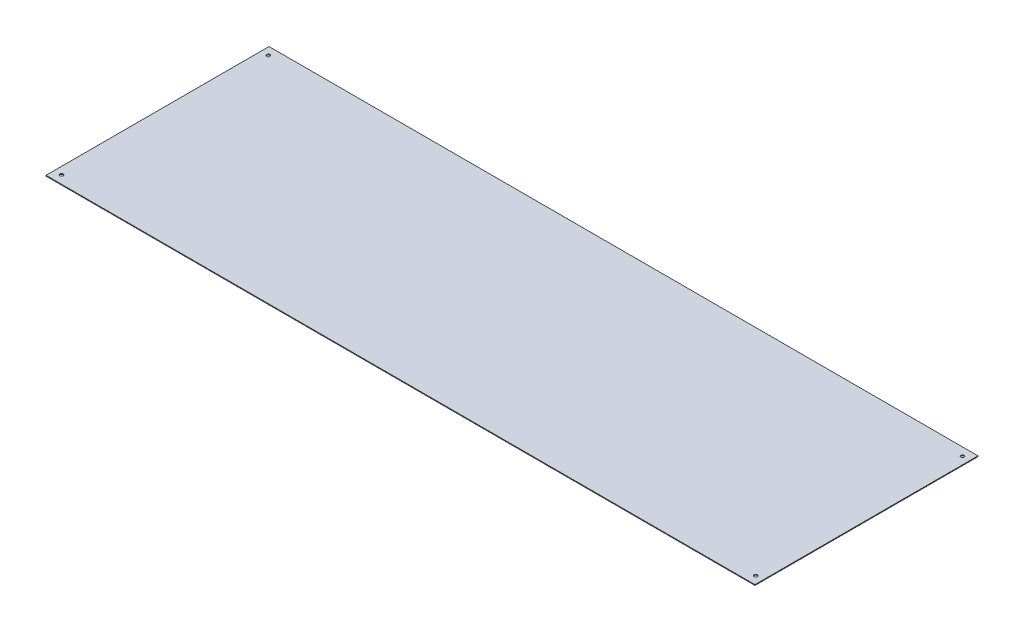
ISO-10303-21;
HEADER;
FILE_DESCRIPTION(('STEP AP214'),'2;1');
FILE_NAME('part.step','',(''),(''),'','','');
FILE_SCHEMA(('AUTOMOTIVE_DESIGN { 1 0 10303 214 1 1 1 1 }'));
ENDSEC;
DATA;
#1=APPLICATION_CONTEXT('core data for automotive mechanical design processes');
#2=APPLICATION_PROTOCOL_DEFINITION('international standard','automotive_design',2000,#1);
#3=PRODUCT_CONTEXT('',#1,'mechanical');
#4=PRODUCT('Part','Part','',(#3));
#5=PRODUCT_RELATED_PRODUCT_CATEGORY('part','',(#4));
#6=PRODUCT_DEFINITION_FORMATION('','',#4);
#7=PRODUCT_DEFINITION_CONTEXT('part definition',#1,'design');
#8=PRODUCT_DEFINITION('design','',#6,#7);
#9=PRODUCT_DEFINITION_SHAPE('','',#8);
#10=(LENGTH_UNIT() NAMED_UNIT(*) SI_UNIT(.MILLI.,.METRE.));
#11=(NAMED_UNIT(*) PLANE_ANGLE_UNIT() SI_UNIT($,.RADIAN.));
#12=(NAMED_UNIT(*) SI_UNIT($,.STERADIAN.) SOLID_ANGLE_UNIT());
#13=UNCERTAINTY_MEASURE_WITH_UNIT(LENGTH_MEASURE(1.E-05),#10,'distance_accuracy_value','');
#14=(GEOMETRIC_REPRESENTATION_CONTEXT(3) GLOBAL_UNCERTAINTY_ASSIGNED_CONTEXT((#13)) GLOBAL_UNIT_ASSIGNED_CONTEXT((#10,
#11,#12)) REPRESENTATION_CONTEXT('',''));
#15=CARTESIAN_POINT('',(0.,0.,0.));
#16=DIRECTION('',(0.,0.,1.));
#17=DIRECTION('',(1.,0.,0.));
#18=AXIS2_PLACEMENT_3D('',#15,#16,#17);
#19=CARTESIAN_POINT('',(960.,0.,302.));
#20=DIRECTION('',(1.,0.,0.));
#21=DIRECTION('',(0.,0.,-1.));
#22=AXIS2_PLACEMENT_3D('',#19,#20,#21);
#23=PLANE('',#22);
#24=DIRECTION('',(0.,1.,0.));
#25=VECTOR('',#24,1.);
#26=CARTESIAN_POINT('',(960.,0.,302.));
#27=LINE('',#26,#25);
#28=CARTESIAN_POINT('',(960.,0.,302.));
#29=VERTEX_POINT('',#28);
#30=CARTESIAN_POINT('',(960.,2.,302.));
#31=VERTEX_POINT('',#30);
#32=EDGE_CURVE('E11',#29,#31,#27,.T.);
#33=ORIENTED_EDGE('',*,*,#32,.F.);
#34=DIRECTION('',(0.,0.,-1.));
#35=VECTOR('',#34,1.);
#36=CARTESIAN_POINT('',(960.,0.,302.));
#37=LINE('',#36,#35);
#38=CARTESIAN_POINT('',(960.,0.,-302.));
#39=VERTEX_POINT('',#38);
#40=EDGE_CURVE('E108',#29,#39,#37,.T.);
#41=ORIENTED_EDGE('',*,*,#40,.T.);
#42=DIRECTION('',(0.,1.,0.));
#43=VECTOR('',#42,1.);
#44=CARTESIAN_POINT('',(960.,0.,-302.));
#45=LINE('',#44,#43);
#46=CARTESIAN_POINT('',(960.,2.,-302.));
#47=VERTEX_POINT('',#46);
#48=EDGE_CURVE('E58',#39,#47,#45,.T.);
#49=ORIENTED_EDGE('',*,*,#48,.T.);
#50=DIRECTION('',(0.,0.,1.));
#51=VECTOR('',#50,1.);
#52=CARTESIAN_POINT('',(960.,2.,0.));
#53=LINE('',#52,#51);
#54=EDGE_CURVE('E122',#31,#47,#53,.F.);
#55=ORIENTED_EDGE('',*,*,#54,.F.);
#56=EDGE_LOOP('',(#33,#41,#49,#55));
#57=FACE_BOUND('',#56,.T.);
#58=ADVANCED_FACE('F47',(#57),#23,.T.);
#59=CARTESIAN_POINT('',(960.,0.,-302.));
#60=DIRECTION('',(0.,0.,-1.));
#61=DIRECTION('',(-1.,0.,0.));
#62=AXIS2_PLACEMENT_3D('',#59,#60,#61);
#63=PLANE('',#62);
#64=ORIENTED_EDGE('',*,*,#48,.F.);
#65=DIRECTION('',(-1.,0.,0.));
#66=VECTOR('',#65,1.);
#67=CARTESIAN_POINT('',(960.,0.,-302.));
#68=LINE('',#67,#66);
#69=CARTESIAN_POINT('',(-960.000000000001,0.,-302.));
#70=VERTEX_POINT('',#69);
#71=EDGE_CURVE('E99',#39,#70,#68,.T.);
#72=ORIENTED_EDGE('',*,*,#71,.T.);
#73=DIRECTION('',(0.,1.,0.));
#74=VECTOR('',#73,1.);
#75=CARTESIAN_POINT('',(-960.000000000001,0.,-302.));
#76=LINE('',#75,#74);
#77=CARTESIAN_POINT('',(-960.000000000001,2.,-302.));
#78=VERTEX_POINT('',#77);
#79=EDGE_CURVE('E66',#70,#78,#76,.T.);
#80=ORIENTED_EDGE('',*,*,#79,.T.);
#81=DIRECTION('',(1.,0.,0.));
#82=VECTOR('',#81,1.);
#83=CARTESIAN_POINT('',(0.,2.,-302.));
#84=LINE('',#83,#82);
#85=EDGE_CURVE('E126',#47,#78,#84,.F.);
#86=ORIENTED_EDGE('',*,*,#85,.F.);
#87=EDGE_LOOP('',(#64,#72,#80,#86));
#88=FACE_BOUND('',#87,.T.);
#89=ADVANCED_FACE('F105',(#88),#63,.T.);
#90=CARTESIAN_POINT('',(-960.000000000001,0.,302.));
#91=DIRECTION('',(-1.,0.,0.));
#92=DIRECTION('',(0.,0.,1.));
#93=AXIS2_PLACEMENT_3D('',#90,#91,#92);
#94=PLANE('',#93);
#95=ORIENTED_EDGE('',*,*,#79,.F.);
#96=DIRECTION('',(0.,0.,1.));
#97=VECTOR('',#96,1.);
#98=CARTESIAN_POINT('',(-960.000000000001,0.,302.));
#99=LINE('',#98,#97);
#100=CARTESIAN_POINT('',(-960.000000000001,0.,302.));
#101=VERTEX_POINT('',#100);
#102=EDGE_CURVE('E88',#70,#101,#99,.T.);
#103=ORIENTED_EDGE('',*,*,#102,.T.);
#104=DIRECTION('',(0.,1.,0.));
#105=VECTOR('',#104,1.);
#106=CARTESIAN_POINT('',(-960.000000000001,0.,302.));
#107=LINE('',#106,#105);
#108=CARTESIAN_POINT('',(-960.000000000001,2.,302.));
#109=VERTEX_POINT('',#108);
#110=EDGE_CURVE('E51',#101,#109,#107,.T.);
#111=ORIENTED_EDGE('',*,*,#110,.T.);
#112=DIRECTION('',(0.,0.,1.));
#113=VECTOR('',#112,1.);
#114=CARTESIAN_POINT('',(-960.000000000001,2.,0.));
#115=LINE('',#114,#113);
#116=EDGE_CURVE('E90',#78,#109,#115,.T.);
#117=ORIENTED_EDGE('',*,*,#116,.F.);
#118=EDGE_LOOP('',(#95,#103,#111,#117));
#119=FACE_BOUND('',#118,.T.);
#120=ADVANCED_FACE('F87',(#119),#94,.T.);
#121=CARTESIAN_POINT('',(-940.,0.,-280.));
#122=DIRECTION('',(0.,1.,0.));
#123=DIRECTION('',(0.,0.,1.));
#124=AXIS2_PLACEMENT_3D('',#121,#122,#123);
#125=CYLINDRICAL_SURFACE('',#124,4.49999999999991);
#126=CARTESIAN_POINT('',(-940.,2.,-280.));
#127=DIRECTION('',(0.,1.,0.));
#128=DIRECTION('',(0.,0.,1.));
#129=AXIS2_PLACEMENT_3D('',#126,#127,#128);
#130=CIRCLE('',#129,4.49999999999991);
#131=CARTESIAN_POINT('',(-940.,2.,-275.5));
#132=VERTEX_POINT('',#131);
#133=EDGE_CURVE('E107',#132,#132,#130,.T.);
#134=ORIENTED_EDGE('',*,*,#133,.T.);
#135=EDGE_LOOP('',(#134));
#136=FACE_BOUND('',#135,.T.);
#137=CARTESIAN_POINT('',(-940.,0.,-280.));
#138=DIRECTION('',(0.,1.,0.));
#139=DIRECTION('',(0.,0.,1.));
#140=AXIS2_PLACEMENT_3D('',#137,#138,#139);
#141=CIRCLE('',#140,4.49999999999991);
#142=CARTESIAN_POINT('',(-940.,0.,-275.5));
#143=VERTEX_POINT('',#142);
#144=EDGE_CURVE('E139',#143,#143,#141,.T.);
#145=ORIENTED_EDGE('',*,*,#144,.F.);
#146=EDGE_LOOP('',(#145));
#147=FACE_BOUND('',#146,.T.);
#148=ADVANCED_FACE('F205',(#136,#147),#125,.F.);
#149=CARTESIAN_POINT('',(940.,0.,-280.));
#150=DIRECTION('',(0.,1.,0.));
#151=DIRECTION('',(0.,0.,1.));
#152=AXIS2_PLACEMENT_3D('',#149,#150,#151);
#153=CYLINDRICAL_SURFACE('',#152,4.49999999999991);
#154=CARTESIAN_POINT('',(940.,2.,-280.));
#155=DIRECTION('',(0.,1.,0.));
#156=DIRECTION('',(0.,0.,1.));
#157=AXIS2_PLACEMENT_3D('',#154,#155,#156);
#158=CIRCLE('',#157,4.49999999999991);
#159=CARTESIAN_POINT('',(940.,2.,-275.5));
#160=VERTEX_POINT('',#159);
#161=EDGE_CURVE('E113',#160,#160,#158,.T.);
#162=ORIENTED_EDGE('',*,*,#161,.T.);
#163=EDGE_LOOP('',(#162));
#164=FACE_BOUND('',#163,.T.);
#165=CARTESIAN_POINT('',(940.,0.,-280.));
#166=DIRECTION('',(0.,1.,0.));
#167=DIRECTION('',(0.,0.,1.));
#168=AXIS2_PLACEMENT_3D('',#165,#166,#167);
#169=CIRCLE('',#168,4.49999999999991);
#170=CARTESIAN_POINT('',(940.,0.,-275.5));
#171=VERTEX_POINT('',#170);
#172=EDGE_CURVE('E143',#171,#171,#169,.T.);
#173=ORIENTED_EDGE('',*,*,#172,.F.);
#174=EDGE_LOOP('',(#173));
#175=FACE_BOUND('',#174,.T.);
#176=ADVANCED_FACE('F170',(#164,#175),#153,.F.);
#177=CARTESIAN_POINT('',(940.,0.,280.));
#178=DIRECTION('',(0.,1.,0.));
#179=DIRECTION('',(0.,0.,1.));
#180=AXIS2_PLACEMENT_3D('',#177,#178,#179);
#181=CYLINDRICAL_SURFACE('',#180,4.49999999999991);
#182=CARTESIAN_POINT('',(940.,2.,280.));
#183=DIRECTION('',(0.,1.,0.));
#184=DIRECTION('',(0.,0.,1.));
#185=AXIS2_PLACEMENT_3D('',#182,#183,#184);
#186=CIRCLE('',#185,4.49999999999991);
#187=CARTESIAN_POINT('',(940.,2.,284.5));
#188=VERTEX_POINT('',#187);
#189=EDGE_CURVE('E159',#188,#188,#186,.T.);
#190=ORIENTED_EDGE('',*,*,#189,.T.);
#191=EDGE_LOOP('',(#190));
#192=FACE_BOUND('',#191,.T.);
#193=CARTESIAN_POINT('',(940.,0.,280.));
#194=DIRECTION('',(0.,1.,0.));
#195=DIRECTION('',(0.,0.,1.));
#196=AXIS2_PLACEMENT_3D('',#193,#194,#195);
#197=CIRCLE('',#196,4.49999999999991);
#198=CARTESIAN_POINT('',(940.,0.,284.5));
#199=VERTEX_POINT('',#198);
#200=EDGE_CURVE('E147',#199,#199,#197,.T.);
#201=ORIENTED_EDGE('',*,*,#200,.F.);
#202=EDGE_LOOP('',(#201));
#203=FACE_BOUND('',#202,.T.);
#204=ADVANCED_FACE('F180',(#192,#203),#181,.F.);
#205=CARTESIAN_POINT('',(-940.,0.,280.));
#206=DIRECTION('',(0.,1.,0.));
#207=DIRECTION('',(0.,0.,1.));
#208=AXIS2_PLACEMENT_3D('',#205,#206,#207);
#209=CYLINDRICAL_SURFACE('',#208,4.49999999999991);
#210=CARTESIAN_POINT('',(-940.,2.,280.));
#211=DIRECTION('',(0.,1.,0.));
#212=DIRECTION('',(0.,0.,1.));
#213=AXIS2_PLACEMENT_3D('',#210,#211,#212);
#214=CIRCLE('',#213,4.49999999999991);
#215=CARTESIAN_POINT('',(-940.,2.,284.5));
#216=VERTEX_POINT('',#215);
#217=EDGE_CURVE('E156',#216,#216,#214,.T.);
#218=ORIENTED_EDGE('',*,*,#217,.T.);
#219=EDGE_LOOP('',(#218));
#220=FACE_BOUND('',#219,.T.);
#221=CARTESIAN_POINT('',(-940.,0.,280.));
#222=DIRECTION('',(0.,1.,0.));
#223=DIRECTION('',(0.,0.,1.));
#224=AXIS2_PLACEMENT_3D('',#221,#222,#223);
#225=CIRCLE('',#224,4.49999999999991);
#226=CARTESIAN_POINT('',(-940.,0.,284.5));
#227=VERTEX_POINT('',#226);
#228=EDGE_CURVE('E103',#227,#227,#225,.T.);
#229=ORIENTED_EDGE('',*,*,#228,.F.);
#230=EDGE_LOOP('',(#229));
#231=FACE_BOUND('',#230,.T.);
#232=ADVANCED_FACE('F183',(#220,#231),#209,.F.);
#233=CARTESIAN_POINT('',(960.,0.,302.));
#234=DIRECTION('',(0.,0.,1.));
#235=DIRECTION('',(1.,0.,0.));
#236=AXIS2_PLACEMENT_3D('',#233,#234,#235);
#237=PLANE('',#236);
#238=DIRECTION('',(1.,0.,0.));
#239=VECTOR('',#238,1.);
#240=CARTESIAN_POINT('',(960.,0.,302.));
#241=LINE('',#240,#239);
#242=EDGE_CURVE('E101',#101,#29,#241,.T.);
#243=ORIENTED_EDGE('',*,*,#242,.T.);
#244=ORIENTED_EDGE('',*,*,#32,.T.);
#245=DIRECTION('',(1.,0.,0.));
#246=VECTOR('',#245,1.);
#247=CARTESIAN_POINT('',(0.,2.,302.));
#248=LINE('',#247,#246);
#249=EDGE_CURVE('E128',#109,#31,#248,.T.);
#250=ORIENTED_EDGE('',*,*,#249,.F.);
#251=ORIENTED_EDGE('',*,*,#110,.F.);
#252=EDGE_LOOP('',(#243,#244,#250,#251));
#253=FACE_BOUND('',#252,.T.);
#254=ADVANCED_FACE('F49',(#253),#237,.T.);
#255=CARTESIAN_POINT('',(0.,2.,0.));
#256=DIRECTION('',(0.,1.,0.));
#257=DIRECTION('',(0.,0.,1.));
#258=AXIS2_PLACEMENT_3D('',#255,#256,#257);
#259=PLANE('',#258);
#260=ORIENTED_EDGE('',*,*,#133,.F.);
#261=EDGE_LOOP('',(#260));
#262=FACE_BOUND('',#261,.T.);
#263=ORIENTED_EDGE('',*,*,#161,.F.);
#264=EDGE_LOOP('',(#263));
#265=FACE_BOUND('',#264,.T.);
#266=ORIENTED_EDGE('',*,*,#189,.F.);
#267=EDGE_LOOP('',(#266));
#268=FACE_BOUND('',#267,.T.);
#269=ORIENTED_EDGE('',*,*,#217,.F.);
#270=EDGE_LOOP('',(#269));
#271=FACE_BOUND('',#270,.T.);
#272=ORIENTED_EDGE('',*,*,#116,.T.);
#273=ORIENTED_EDGE('',*,*,#249,.T.);
#274=ORIENTED_EDGE('',*,*,#54,.T.);
#275=ORIENTED_EDGE('',*,*,#85,.T.);
#276=EDGE_LOOP('',(#272,#273,#274,#275));
#277=FACE_BOUND('',#276,.T.);
#278=ADVANCED_FACE('F125',(#262,#265,#268,#271,#277),#259,.T.);
#279=CARTESIAN_POINT('',(0.,0.,0.));
#280=DIRECTION('',(0.,1.,0.));
#281=DIRECTION('',(0.,0.,1.));
#282=AXIS2_PLACEMENT_3D('',#279,#280,#281);
#283=PLANE('',#282);
#284=ORIENTED_EDGE('',*,*,#144,.T.);
#285=EDGE_LOOP('',(#284));
#286=FACE_BOUND('',#285,.T.);
#287=ORIENTED_EDGE('',*,*,#172,.T.);
#288=EDGE_LOOP('',(#287));
#289=FACE_BOUND('',#288,.T.);
#290=ORIENTED_EDGE('',*,*,#200,.T.);
#291=EDGE_LOOP('',(#290));
#292=FACE_BOUND('',#291,.T.);
#293=ORIENTED_EDGE('',*,*,#228,.T.);
#294=EDGE_LOOP('',(#293));
#295=FACE_BOUND('',#294,.T.);
#296=ORIENTED_EDGE('',*,*,#102,.F.);
#297=ORIENTED_EDGE('',*,*,#71,.F.);
#298=ORIENTED_EDGE('',*,*,#40,.F.);
#299=ORIENTED_EDGE('',*,*,#242,.F.);
#300=EDGE_LOOP('',(#296,#297,#298,#299));
#301=FACE_BOUND('',#300,.T.);
#302=ADVANCED_FACE('F97',(#286,#289,#292,#295,#301),#283,.F.);
#303=CLOSED_SHELL('',(#58,#89,#120,#148,#176,#204,#232,#254,#278,#302));
#304=MANIFOLD_SOLID_BREP('B2',#303);
#305=ADVANCED_BREP_SHAPE_REPRESENTATION('',(#18,#304),#14);
#306=SHAPE_DEFINITION_REPRESENTATION(#9,#305);
ENDSEC;
END-ISO-10303-21;
